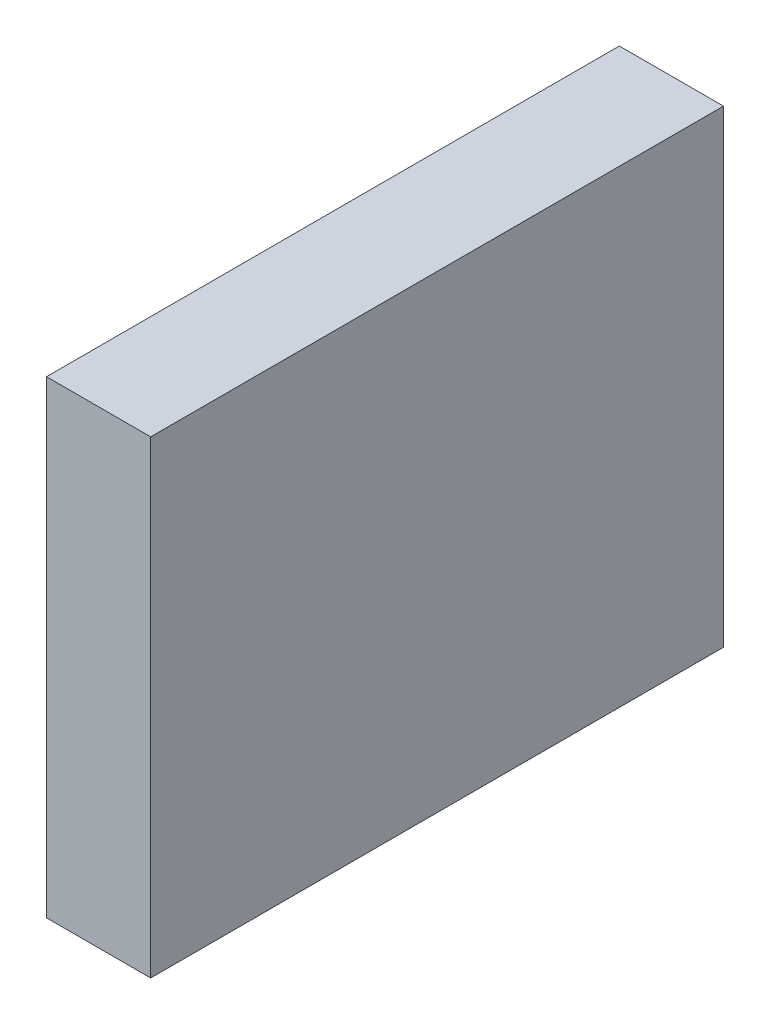
ISO-10303-21;
HEADER;
FILE_DESCRIPTION(('STEP AP214'),'2;1');
FILE_NAME('part.step','',(''),(''),'','','');
FILE_SCHEMA(('AUTOMOTIVE_DESIGN { 1 0 10303 214 1 1 1 1 }'));
ENDSEC;
DATA;
#1=APPLICATION_CONTEXT('core data for automotive mechanical design processes');
#2=APPLICATION_PROTOCOL_DEFINITION('international standard','automotive_design',2000,#1);
#3=PRODUCT_CONTEXT('',#1,'mechanical');
#4=PRODUCT('Part','Part','',(#3));
#5=PRODUCT_RELATED_PRODUCT_CATEGORY('part','',(#4));
#6=PRODUCT_DEFINITION_FORMATION('','',#4);
#7=PRODUCT_DEFINITION_CONTEXT('part definition',#1,'design');
#8=PRODUCT_DEFINITION('design','',#6,#7);
#9=PRODUCT_DEFINITION_SHAPE('','',#8);
#10=(LENGTH_UNIT() NAMED_UNIT(*) SI_UNIT(.MILLI.,.METRE.));
#11=(NAMED_UNIT(*) PLANE_ANGLE_UNIT() SI_UNIT($,.RADIAN.));
#12=(NAMED_UNIT(*) SI_UNIT($,.STERADIAN.) SOLID_ANGLE_UNIT());
#13=UNCERTAINTY_MEASURE_WITH_UNIT(LENGTH_MEASURE(1.E-05),#10,'distance_accuracy_value','');
#14=(GEOMETRIC_REPRESENTATION_CONTEXT(3) GLOBAL_UNCERTAINTY_ASSIGNED_CONTEXT((#13)) GLOBAL_UNIT_ASSIGNED_CONTEXT((#10,
#11,#12)) REPRESENTATION_CONTEXT('',''));
#15=CARTESIAN_POINT('',(0.,0.,0.));
#16=DIRECTION('',(0.,0.,1.));
#17=DIRECTION('',(1.,0.,0.));
#18=AXIS2_PLACEMENT_3D('',#15,#16,#17);
#19=CARTESIAN_POINT('',(0.,18.,22.));
#20=DIRECTION('',(1.,0.,0.));
#21=DIRECTION('',(0.,0.,-1.));
#22=AXIS2_PLACEMENT_3D('',#19,#20,#21);
#23=PLANE('',#22);
#24=DIRECTION('',(0.,-1.,0.));
#25=VECTOR('',#24,1.);
#26=CARTESIAN_POINT('',(0.,18.,0.));
#27=LINE('',#26,#25);
#28=CARTESIAN_POINT('',(0.,18.,0.));
#29=VERTEX_POINT('',#28);
#30=CARTESIAN_POINT('',(0.,0.,0.));
#31=VERTEX_POINT('',#30);
#32=EDGE_CURVE('E102',#29,#31,#27,.T.);
#33=ORIENTED_EDGE('',*,*,#32,.T.);
#34=DIRECTION('',(0.,0.,-1.));
#35=VECTOR('',#34,1.);
#36=CARTESIAN_POINT('',(0.,0.,22.));
#37=LINE('',#36,#35);
#38=CARTESIAN_POINT('',(0.,0.,22.));
#39=VERTEX_POINT('',#38);
#40=EDGE_CURVE('E11',#39,#31,#37,.T.);
#41=ORIENTED_EDGE('',*,*,#40,.F.);
#42=DIRECTION('',(0.,-1.,0.));
#43=VECTOR('',#42,1.);
#44=CARTESIAN_POINT('',(0.,18.,22.));
#45=LINE('',#44,#43);
#46=CARTESIAN_POINT('',(0.,18.,22.));
#47=VERTEX_POINT('',#46);
#48=EDGE_CURVE('E90',#47,#39,#45,.T.);
#49=ORIENTED_EDGE('',*,*,#48,.F.);
#50=DIRECTION('',(0.,0.,-1.));
#51=VECTOR('',#50,1.);
#52=CARTESIAN_POINT('',(0.,18.,22.));
#53=LINE('',#52,#51);
#54=EDGE_CURVE('E98',#47,#29,#53,.T.);
#55=ORIENTED_EDGE('',*,*,#54,.T.);
#56=EDGE_LOOP('',(#33,#41,#49,#55));
#57=FACE_BOUND('',#56,.T.);
#58=ADVANCED_FACE('F39',(#57),#23,.F.);
#59=CARTESIAN_POINT('',(0.,0.,22.));
#60=DIRECTION('',(0.,1.,0.));
#61=DIRECTION('',(0.,0.,1.));
#62=AXIS2_PLACEMENT_3D('',#59,#60,#61);
#63=PLANE('',#62);
#64=DIRECTION('',(1.,0.,0.));
#65=VECTOR('',#64,1.);
#66=CARTESIAN_POINT('',(0.,0.,0.));
#67=LINE('',#66,#65);
#68=CARTESIAN_POINT('',(4.,0.,0.));
#69=VERTEX_POINT('',#68);
#70=EDGE_CURVE('E94',#31,#69,#67,.T.);
#71=ORIENTED_EDGE('',*,*,#70,.T.);
#72=DIRECTION('',(0.,0.,-1.));
#73=VECTOR('',#72,1.);
#74=CARTESIAN_POINT('',(4.,0.,22.));
#75=LINE('',#74,#73);
#76=CARTESIAN_POINT('',(4.,0.,22.));
#77=VERTEX_POINT('',#76);
#78=EDGE_CURVE('E47',#77,#69,#75,.T.);
#79=ORIENTED_EDGE('',*,*,#78,.F.);
#80=DIRECTION('',(1.,0.,0.));
#81=VECTOR('',#80,1.);
#82=CARTESIAN_POINT('',(0.,0.,22.));
#83=LINE('',#82,#81);
#84=EDGE_CURVE('E85',#39,#77,#83,.T.);
#85=ORIENTED_EDGE('',*,*,#84,.F.);
#86=ORIENTED_EDGE('',*,*,#40,.T.);
#87=EDGE_LOOP('',(#71,#79,#85,#86));
#88=FACE_BOUND('',#87,.T.);
#89=ADVANCED_FACE('F93',(#88),#63,.F.);
#90=CARTESIAN_POINT('',(4.,0.,22.));
#91=DIRECTION('',(-1.,0.,0.));
#92=DIRECTION('',(0.,0.,1.));
#93=AXIS2_PLACEMENT_3D('',#90,#91,#92);
#94=PLANE('',#93);
#95=DIRECTION('',(0.,1.,0.));
#96=VECTOR('',#95,1.);
#97=CARTESIAN_POINT('',(4.,0.,0.));
#98=LINE('',#97,#96);
#99=CARTESIAN_POINT('',(4.,18.,0.));
#100=VERTEX_POINT('',#99);
#101=EDGE_CURVE('E72',#69,#100,#98,.T.);
#102=ORIENTED_EDGE('',*,*,#101,.T.);
#103=DIRECTION('',(0.,0.,-1.));
#104=VECTOR('',#103,1.);
#105=CARTESIAN_POINT('',(4.,18.,22.));
#106=LINE('',#105,#104);
#107=CARTESIAN_POINT('',(4.,18.,22.));
#108=VERTEX_POINT('',#107);
#109=EDGE_CURVE('E95',#108,#100,#106,.T.);
#110=ORIENTED_EDGE('',*,*,#109,.F.);
#111=DIRECTION('',(0.,1.,0.));
#112=VECTOR('',#111,1.);
#113=CARTESIAN_POINT('',(4.,0.,22.));
#114=LINE('',#113,#112);
#115=EDGE_CURVE('E88',#77,#108,#114,.T.);
#116=ORIENTED_EDGE('',*,*,#115,.F.);
#117=ORIENTED_EDGE('',*,*,#78,.T.);
#118=EDGE_LOOP('',(#102,#110,#116,#117));
#119=FACE_BOUND('',#118,.T.);
#120=ADVANCED_FACE('F96',(#119),#94,.F.);
#121=CARTESIAN_POINT('',(4.,18.,22.));
#122=DIRECTION('',(0.,-1.,0.));
#123=DIRECTION('',(0.,0.,-1.));
#124=AXIS2_PLACEMENT_3D('',#121,#122,#123);
#125=PLANE('',#124);
#126=DIRECTION('',(-1.,0.,0.));
#127=VECTOR('',#126,1.);
#128=CARTESIAN_POINT('',(4.,18.,0.));
#129=LINE('',#128,#127);
#130=EDGE_CURVE('E78',#100,#29,#129,.T.);
#131=ORIENTED_EDGE('',*,*,#130,.T.);
#132=ORIENTED_EDGE('',*,*,#54,.F.);
#133=DIRECTION('',(-1.,0.,0.));
#134=VECTOR('',#133,1.);
#135=CARTESIAN_POINT('',(4.,18.,22.));
#136=LINE('',#135,#134);
#137=EDGE_CURVE('E55',#108,#47,#136,.T.);
#138=ORIENTED_EDGE('',*,*,#137,.F.);
#139=ORIENTED_EDGE('',*,*,#109,.T.);
#140=EDGE_LOOP('',(#131,#132,#138,#139));
#141=FACE_BOUND('',#140,.T.);
#142=ADVANCED_FACE('F109',(#141),#125,.F.);
#143=CARTESIAN_POINT('',(0.,0.,22.));
#144=DIRECTION('',(0.,0.,1.));
#145=DIRECTION('',(1.,0.,0.));
#146=AXIS2_PLACEMENT_3D('',#143,#144,#145);
#147=PLANE('',#146);
#148=ORIENTED_EDGE('',*,*,#48,.T.);
#149=ORIENTED_EDGE('',*,*,#84,.T.);
#150=ORIENTED_EDGE('',*,*,#115,.T.);
#151=ORIENTED_EDGE('',*,*,#137,.T.);
#152=EDGE_LOOP('',(#148,#149,#150,#151));
#153=FACE_BOUND('',#152,.T.);
#154=ADVANCED_FACE('F86',(#153),#147,.T.);
#155=CARTESIAN_POINT('',(0.,0.,0.));
#156=DIRECTION('',(0.,0.,1.));
#157=DIRECTION('',(1.,0.,0.));
#158=AXIS2_PLACEMENT_3D('',#155,#156,#157);
#159=PLANE('',#158);
#160=ORIENTED_EDGE('',*,*,#32,.F.);
#161=ORIENTED_EDGE('',*,*,#130,.F.);
#162=ORIENTED_EDGE('',*,*,#101,.F.);
#163=ORIENTED_EDGE('',*,*,#70,.F.);
#164=EDGE_LOOP('',(#160,#161,#162,#163));
#165=FACE_BOUND('',#164,.T.);
#166=ADVANCED_FACE('F112',(#165),#159,.F.);
#167=CLOSED_SHELL('',(#58,#89,#120,#142,#154,#166));
#168=MANIFOLD_SOLID_BREP('B2',#167);
#169=ADVANCED_BREP_SHAPE_REPRESENTATION('',(#18,#168),#14);
#170=SHAPE_DEFINITION_REPRESENTATION(#9,#169);
ENDSEC;
END-ISO-10303-21;
